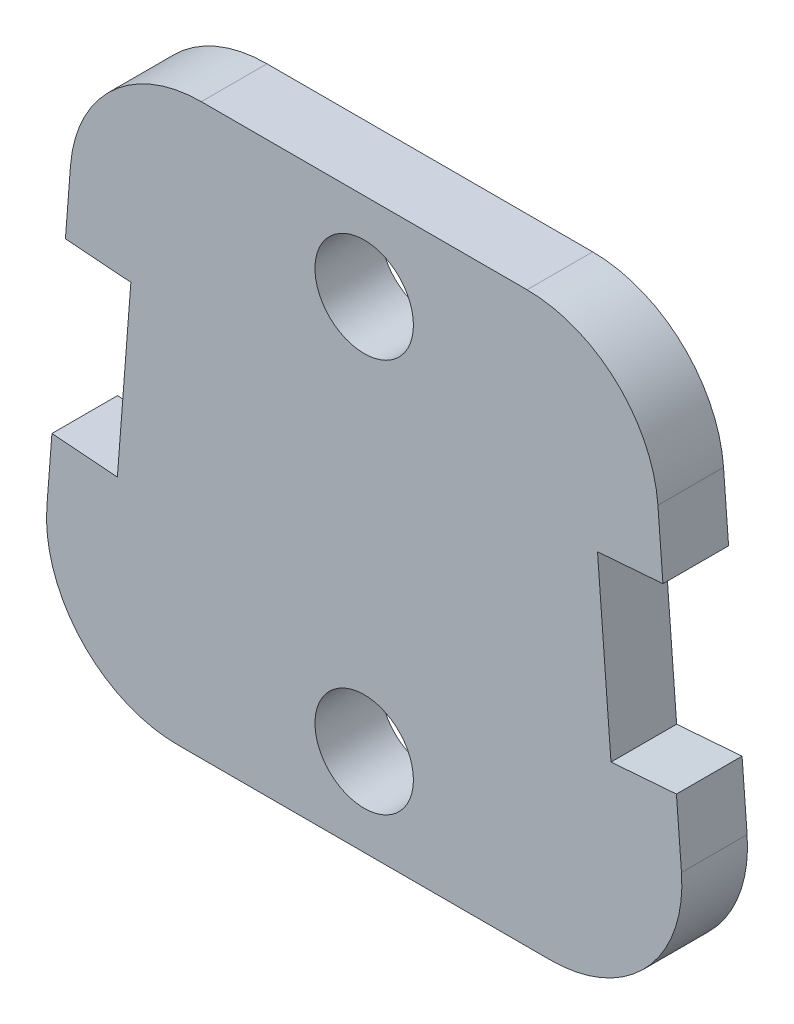
ISO-10303-21;
HEADER;
FILE_DESCRIPTION(('STEP AP214'),'2;1');
FILE_NAME('part.step','',(''),(''),'','','');
FILE_SCHEMA(('AUTOMOTIVE_DESIGN { 1 0 10303 214 1 1 1 1 }'));
ENDSEC;
DATA;
#1=APPLICATION_CONTEXT('core data for automotive mechanical design processes');
#2=APPLICATION_PROTOCOL_DEFINITION('international standard','automotive_design',2000,#1);
#3=PRODUCT_CONTEXT('',#1,'mechanical');
#4=PRODUCT('Part','Part','',(#3));
#5=PRODUCT_RELATED_PRODUCT_CATEGORY('part','',(#4));
#6=PRODUCT_DEFINITION_FORMATION('','',#4);
#7=PRODUCT_DEFINITION_CONTEXT('part definition',#1,'design');
#8=PRODUCT_DEFINITION('design','',#6,#7);
#9=PRODUCT_DEFINITION_SHAPE('','',#8);
#10=(LENGTH_UNIT() NAMED_UNIT(*) SI_UNIT(.MILLI.,.METRE.));
#11=(NAMED_UNIT(*) PLANE_ANGLE_UNIT() SI_UNIT($,.RADIAN.));
#12=(NAMED_UNIT(*) SI_UNIT($,.STERADIAN.) SOLID_ANGLE_UNIT());
#13=UNCERTAINTY_MEASURE_WITH_UNIT(LENGTH_MEASURE(1.E-05),#10,'distance_accuracy_value','');
#14=(GEOMETRIC_REPRESENTATION_CONTEXT(3) GLOBAL_UNCERTAINTY_ASSIGNED_CONTEXT((#13)) GLOBAL_UNIT_ASSIGNED_CONTEXT((#10,
#11,#12)) REPRESENTATION_CONTEXT('',''));
#15=CARTESIAN_POINT('',(0.,0.,0.));
#16=DIRECTION('',(0.,0.,1.));
#17=DIRECTION('',(1.,0.,0.));
#18=AXIS2_PLACEMENT_3D('',#15,#16,#17);
#19=CARTESIAN_POINT('',(0.,0.,3.175));
#20=DIRECTION('',(0.,0.,1.));
#21=DIRECTION('',(1.,0.,0.));
#22=AXIS2_PLACEMENT_3D('',#19,#20,#21);
#23=PLANE('',#22);
#24=CARTESIAN_POINT('',(0.,4.233333291,3.175));
#25=DIRECTION('',(0.,0.,1.));
#26=DIRECTION('',(1.,0.,0.));
#27=AXIS2_PLACEMENT_3D('',#24,#25,#26);
#28=CIRCLE('',#27,2.38125);
#29=CARTESIAN_POINT('',(2.38125,4.233333291,3.175));
#30=VERTEX_POINT('',#29);
#31=EDGE_CURVE('E205',#30,#30,#28,.T.);
#32=ORIENTED_EDGE('',*,*,#31,.F.);
#33=EDGE_LOOP('',(#32));
#34=FACE_BOUND('',#33,.T.);
#35=CARTESIAN_POINT('',(0.,23.283333291,3.175));
#36=DIRECTION('',(0.,0.,1.));
#37=DIRECTION('',(1.,0.,0.));
#38=AXIS2_PLACEMENT_3D('',#35,#36,#37);
#39=CIRCLE('',#38,2.38125);
#40=CARTESIAN_POINT('',(2.38125,23.283333291,3.175));
#41=VERTEX_POINT('',#40);
#42=EDGE_CURVE('E208',#41,#41,#39,.T.);
#43=ORIENTED_EDGE('',*,*,#42,.F.);
#44=EDGE_LOOP('',(#43));
#45=FACE_BOUND('',#44,.T.);
#46=DIRECTION('',(0.0766964988847375,0.997054485501582,0.));
#47=VECTOR('',#46,1.);
#48=CARTESIAN_POINT('',(-12.6159696555913,0.970459204276261,3.175));
#49=LINE('',#48,#47);
#50=CARTESIAN_POINT('',(-11.9399157962721,9.75915937542656,3.175));
#51=VERTEX_POINT('',#50);
#52=CARTESIAN_POINT('',(-11.2871949744466,18.2445300591582,3.175));
#53=VERTEX_POINT('',#52);
#54=EDGE_CURVE('E155',#51,#53,#49,.T.);
#55=ORIENTED_EDGE('',*,*,#54,.F.);
#56=DIRECTION('',(-0.997054485501582,0.0766964988847375,0.));
#57=VECTOR('',#56,1.);
#58=CARTESIAN_POINT('',(-11.9399157962721,9.75915937542656,3.175));
#59=LINE('',#58,#57);
#60=CARTESIAN_POINT('',(-15.1055637877396,10.0026707593856,3.175));
#61=VERTEX_POINT('',#60);
#62=EDGE_CURVE('E164',#51,#61,#59,.T.);
#63=ORIENTED_EDGE('',*,*,#62,.T.);
#64=DIRECTION('',(0.0766964988847375,0.997054485501582,0.));
#65=VECTOR('',#64,1.);
#66=CARTESIAN_POINT('',(-15.7816176470588,1.2139705882353,3.175));
#67=LINE('',#66,#65);
#68=CARTESIAN_POINT('',(-15.3490751716986,6.83702276791813,3.175));
#69=VERTEX_POINT('',#68);
#70=EDGE_CURVE('E217',#69,#61,#67,.T.);
#71=ORIENTED_EDGE('',*,*,#70,.F.);
#72=CARTESIAN_POINT('',(-9.01777918876356,6.35,3.175));
#73=DIRECTION('',(0.,0.,1.));
#74=DIRECTION('',(1.,0.,0.));
#75=AXIS2_PLACEMENT_3D('',#72,#73,#74);
#76=CIRCLE('',#75,6.35);
#77=CARTESIAN_POINT('',(-9.01777918876352,0.,3.175));
#78=VERTEX_POINT('',#77);
#79=EDGE_CURVE('E220',#78,#69,#76,.F.);
#80=ORIENTED_EDGE('',*,*,#79,.F.);
#81=DIRECTION('',(1.,0.,0.));
#82=VECTOR('',#81,1.);
#83=CARTESIAN_POINT('',(0.,0.,3.175));
#84=LINE('',#83,#82);
#85=CARTESIAN_POINT('',(9.01777918876352,0.,3.175));
#86=VERTEX_POINT('',#85);
#87=EDGE_CURVE('E223',#78,#86,#84,.T.);
#88=ORIENTED_EDGE('',*,*,#87,.T.);
#89=CARTESIAN_POINT('',(9.01777918876357,6.35,3.175));
#90=DIRECTION('',(0.,0.,1.));
#91=DIRECTION('',(1.,0.,0.));
#92=AXIS2_PLACEMENT_3D('',#89,#90,#91);
#93=CIRCLE('',#92,6.35);
#94=CARTESIAN_POINT('',(15.3490751716986,6.83702276791813,3.175));
#95=VERTEX_POINT('',#94);
#96=EDGE_CURVE('E226',#86,#95,#93,.T.);
#97=ORIENTED_EDGE('',*,*,#96,.T.);
#98=DIRECTION('',(0.0766964988847368,-0.997054485501582,0.));
#99=VECTOR('',#98,1.);
#100=CARTESIAN_POINT('',(15.7816176470588,1.21397058823529,3.175));
#101=LINE('',#100,#99);
#102=CARTESIAN_POINT('',(15.1055637877396,10.0026707593857,3.175));
#103=VERTEX_POINT('',#102);
#104=EDGE_CURVE('E229',#103,#95,#101,.T.);
#105=ORIENTED_EDGE('',*,*,#104,.F.);
#106=DIRECTION('',(-0.997054485501582,-0.0766964988847379,0.));
#107=VECTOR('',#106,1.);
#108=CARTESIAN_POINT('',(15.1055637877396,10.0026707593857,3.175));
#109=LINE('',#108,#107);
#110=CARTESIAN_POINT('',(11.9399157962721,9.75915937542662,3.175));
#111=VERTEX_POINT('',#110);
#112=EDGE_CURVE('E194',#103,#111,#109,.T.);
#113=ORIENTED_EDGE('',*,*,#112,.T.);
#114=DIRECTION('',(-0.0766964988847378,0.997054485501582,0.));
#115=VECTOR('',#114,1.);
#116=CARTESIAN_POINT('',(11.9399157962721,9.75915937542662,3.175));
#117=LINE('',#116,#115);
#118=CARTESIAN_POINT('',(11.2871949744466,18.2445300591583,3.175));
#119=VERTEX_POINT('',#118);
#120=EDGE_CURVE('E187',#111,#119,#117,.T.);
#121=ORIENTED_EDGE('',*,*,#120,.T.);
#122=DIRECTION('',(-0.997054485501582,-0.0766964988847379,0.));
#123=VECTOR('',#122,1.);
#124=CARTESIAN_POINT('',(14.4528429659141,18.4880414431173,3.175));
#125=LINE('',#124,#123);
#126=CARTESIAN_POINT('',(14.4528429659141,18.4880414431173,3.175));
#127=VERTEX_POINT('',#126);
#128=EDGE_CURVE('E189',#127,#119,#125,.T.);
#129=ORIENTED_EDGE('',*,*,#128,.F.);
#130=CARTESIAN_POINT('',(14.209331581955,21.6536894345847,3.175));
#131=VERTEX_POINT('',#130);
#132=EDGE_CURVE('E230',#131,#127,#101,.T.);
#133=ORIENTED_EDGE('',*,*,#132,.F.);
#134=CARTESIAN_POINT('',(7.87803559901998,21.1666666666667,3.175));
#135=DIRECTION('',(0.,0.,1.));
#136=DIRECTION('',(1.,0.,0.));
#137=AXIS2_PLACEMENT_3D('',#134,#135,#136);
#138=CIRCLE('',#137,6.35);
#139=CARTESIAN_POINT('',(7.87803559901994,27.5166666666667,3.175));
#140=VERTEX_POINT('',#139);
#141=EDGE_CURVE('E233',#140,#131,#138,.F.);
#142=ORIENTED_EDGE('',*,*,#141,.F.);
#143=DIRECTION('',(1.,0.,0.));
#144=VECTOR('',#143,1.);
#145=CARTESIAN_POINT('',(0.,27.5166666666667,3.175));
#146=LINE('',#145,#144);
#147=CARTESIAN_POINT('',(-7.87803559901993,27.5166666666667,3.175));
#148=VERTEX_POINT('',#147);
#149=EDGE_CURVE('E212',#148,#140,#146,.T.);
#150=ORIENTED_EDGE('',*,*,#149,.F.);
#151=CARTESIAN_POINT('',(-7.87803559901997,21.1666666666667,3.175));
#152=DIRECTION('',(0.,0.,1.));
#153=DIRECTION('',(1.,0.,0.));
#154=AXIS2_PLACEMENT_3D('',#151,#152,#153);
#155=CIRCLE('',#154,6.35);
#156=CARTESIAN_POINT('',(-14.209331581955,21.6536894345847,3.175));
#157=VERTEX_POINT('',#156);
#158=EDGE_CURVE('E215',#148,#157,#155,.T.);
#159=ORIENTED_EDGE('',*,*,#158,.T.);
#160=CARTESIAN_POINT('',(-14.4528429659141,18.4880414431173,3.175));
#161=VERTEX_POINT('',#160);
#162=EDGE_CURVE('E176',#161,#157,#67,.T.);
#163=ORIENTED_EDGE('',*,*,#162,.F.);
#164=DIRECTION('',(-0.997054485501582,0.0766964988847375,0.));
#165=VECTOR('',#164,1.);
#166=CARTESIAN_POINT('',(-11.2871949744466,18.2445300591582,3.175));
#167=LINE('',#166,#165);
#168=EDGE_CURVE('E168',#53,#161,#167,.T.);
#169=ORIENTED_EDGE('',*,*,#168,.F.);
#170=EDGE_LOOP('',(#55,#63,#71,#80,#88,#97,#105,#113,#121,#129,#133,#142,#150,#159,#163,#169));
#171=FACE_BOUND('',#170,.T.);
#172=ADVANCED_FACE('F44',(#34,#45,#171),#23,.T.);
#173=CARTESIAN_POINT('',(-15.7816176470588,1.2139705882353,3.175));
#174=DIRECTION('',(-0.997054485501582,0.0766964988847375,0.));
#175=DIRECTION('',(-0.0766964988847375,-0.997054485501582,0.));
#176=AXIS2_PLACEMENT_3D('',#173,#174,#175);
#177=PLANE('',#176);
#178=ORIENTED_EDGE('',*,*,#70,.T.);
#179=DIRECTION('',(0.,0.,-1.));
#180=VECTOR('',#179,1.);
#181=CARTESIAN_POINT('',(-15.1055637877396,10.0026707593856,3.175));
#182=LINE('',#181,#180);
#183=CARTESIAN_POINT('',(-15.1055637877396,10.0026707593856,0.));
#184=VERTEX_POINT('',#183);
#185=EDGE_CURVE('E172',#61,#184,#182,.T.);
#186=ORIENTED_EDGE('',*,*,#185,.T.);
#187=DIRECTION('',(0.0766964988847375,0.997054485501582,0.));
#188=VECTOR('',#187,1.);
#189=CARTESIAN_POINT('',(-15.7816176470588,1.2139705882353,0.));
#190=LINE('',#189,#188);
#191=CARTESIAN_POINT('',(-15.3490751716986,6.83702276791813,0.));
#192=VERTEX_POINT('',#191);
#193=EDGE_CURVE('E249',#192,#184,#190,.T.);
#194=ORIENTED_EDGE('',*,*,#193,.F.);
#195=DIRECTION('',(0.,0.,-1.));
#196=VECTOR('',#195,1.);
#197=CARTESIAN_POINT('',(-15.3490751716986,6.83702276791813,3.175));
#198=LINE('',#197,#196);
#199=EDGE_CURVE('E278',#69,#192,#198,.T.);
#200=ORIENTED_EDGE('',*,*,#199,.F.);
#201=EDGE_LOOP('',(#178,#186,#194,#200));
#202=FACE_BOUND('',#201,.T.);
#203=ADVANCED_FACE('F323',(#202),#177,.T.);
#204=CARTESIAN_POINT('',(15.7816176470588,1.21397058823529,3.175));
#205=DIRECTION('',(0.997054485501582,0.0766964988847368,0.));
#206=DIRECTION('',(-0.0766964988847368,0.997054485501582,0.));
#207=AXIS2_PLACEMENT_3D('',#204,#205,#206);
#208=PLANE('',#207);
#209=DIRECTION('',(0.0766964988847368,-0.997054485501582,0.));
#210=VECTOR('',#209,1.);
#211=CARTESIAN_POINT('',(15.7816176470588,1.21397058823529,0.));
#212=LINE('',#211,#210);
#213=CARTESIAN_POINT('',(15.1055637877396,10.0026707593857,0.));
#214=VERTEX_POINT('',#213);
#215=CARTESIAN_POINT('',(15.3490751716986,6.83702276791813,0.));
#216=VERTEX_POINT('',#215);
#217=EDGE_CURVE('E261',#214,#216,#212,.T.);
#218=ORIENTED_EDGE('',*,*,#217,.F.);
#219=DIRECTION('',(0.,0.,-1.));
#220=VECTOR('',#219,1.);
#221=CARTESIAN_POINT('',(15.1055637877396,10.0026707593857,3.175));
#222=LINE('',#221,#220);
#223=EDGE_CURVE('E186',#103,#214,#222,.T.);
#224=ORIENTED_EDGE('',*,*,#223,.F.);
#225=ORIENTED_EDGE('',*,*,#104,.T.);
#226=DIRECTION('',(0.,0.,-1.));
#227=VECTOR('',#226,1.);
#228=CARTESIAN_POINT('',(15.3490751716986,6.83702276791813,3.175));
#229=LINE('',#228,#227);
#230=EDGE_CURVE('E270',#95,#216,#229,.T.);
#231=ORIENTED_EDGE('',*,*,#230,.T.);
#232=EDGE_LOOP('',(#218,#224,#225,#231));
#233=FACE_BOUND('',#232,.T.);
#234=ADVANCED_FACE('F306',(#233),#208,.T.);
#235=CARTESIAN_POINT('',(0.,27.5166666666667,3.175));
#236=DIRECTION('',(0.,1.,0.));
#237=DIRECTION('',(-1.,0.,0.));
#238=AXIS2_PLACEMENT_3D('',#235,#236,#237);
#239=PLANE('',#238);
#240=DIRECTION('',(1.,0.,0.));
#241=VECTOR('',#240,1.);
#242=CARTESIAN_POINT('',(0.,27.5166666666667,0.));
#243=LINE('',#242,#241);
#244=CARTESIAN_POINT('',(-7.87803559901993,27.5166666666667,0.));
#245=VERTEX_POINT('',#244);
#246=CARTESIAN_POINT('',(7.87803559901994,27.5166666666667,0.));
#247=VERTEX_POINT('',#246);
#248=EDGE_CURVE('E242',#245,#247,#243,.T.);
#249=ORIENTED_EDGE('',*,*,#248,.F.);
#250=DIRECTION('',(0.,0.,-1.));
#251=VECTOR('',#250,1.);
#252=CARTESIAN_POINT('',(-7.87803559901993,27.5166666666667,3.175));
#253=LINE('',#252,#251);
#254=EDGE_CURVE('E283',#148,#245,#253,.T.);
#255=ORIENTED_EDGE('',*,*,#254,.F.);
#256=ORIENTED_EDGE('',*,*,#149,.T.);
#257=DIRECTION('',(0.,0.,-1.));
#258=VECTOR('',#257,1.);
#259=CARTESIAN_POINT('',(7.87803559901994,27.5166666666667,3.175));
#260=LINE('',#259,#258);
#261=EDGE_CURVE('E236',#140,#247,#260,.T.);
#262=ORIENTED_EDGE('',*,*,#261,.T.);
#263=EDGE_LOOP('',(#249,#255,#256,#262));
#264=FACE_BOUND('',#263,.T.);
#265=ADVANCED_FACE('F372',(#264),#239,.T.);
#266=CARTESIAN_POINT('',(-7.87803559901997,21.1666666666667,3.175));
#267=DIRECTION('',(0.,0.,-1.));
#268=DIRECTION('',(-1.,0.,0.));
#269=AXIS2_PLACEMENT_3D('',#266,#267,#268);
#270=CYLINDRICAL_SURFACE('',#269,6.35);
#271=CARTESIAN_POINT('',(-7.87803559901997,21.1666666666667,0.));
#272=DIRECTION('',(0.,0.,1.));
#273=DIRECTION('',(1.,0.,0.));
#274=AXIS2_PLACEMENT_3D('',#271,#272,#273);
#275=CIRCLE('',#274,6.35);
#276=CARTESIAN_POINT('',(-14.209331581955,21.6536894345847,0.));
#277=VERTEX_POINT('',#276);
#278=EDGE_CURVE('E245',#245,#277,#275,.T.);
#279=ORIENTED_EDGE('',*,*,#278,.T.);
#280=DIRECTION('',(0.,0.,-1.));
#281=VECTOR('',#280,1.);
#282=CARTESIAN_POINT('',(-14.209331581955,21.6536894345847,3.175));
#283=LINE('',#282,#281);
#284=EDGE_CURVE('E280',#157,#277,#283,.T.);
#285=ORIENTED_EDGE('',*,*,#284,.F.);
#286=ORIENTED_EDGE('',*,*,#158,.F.);
#287=ORIENTED_EDGE('',*,*,#254,.T.);
#288=EDGE_LOOP('',(#279,#285,#286,#287));
#289=FACE_BOUND('',#288,.T.);
#290=ADVANCED_FACE('F368',(#289),#270,.T.);
#291=DIRECTION('',(0.,0.,-1.));
#292=VECTOR('',#291,1.);
#293=CARTESIAN_POINT('',(-14.4528429659141,18.4880414431173,3.175));
#294=LINE('',#293,#292);
#295=CARTESIAN_POINT('',(-14.4528429659141,18.4880414431173,0.));
#296=VERTEX_POINT('',#295);
#297=EDGE_CURVE('E326',#161,#296,#294,.T.);
#298=ORIENTED_EDGE('',*,*,#297,.F.);
#299=ORIENTED_EDGE('',*,*,#162,.T.);
#300=ORIENTED_EDGE('',*,*,#284,.T.);
#301=EDGE_CURVE('E248',#296,#277,#190,.T.);
#302=ORIENTED_EDGE('',*,*,#301,.F.);
#303=EDGE_LOOP('',(#298,#299,#300,#302));
#304=FACE_BOUND('',#303,.T.);
#305=ADVANCED_FACE('F346',(#304),#177,.T.);
#306=CARTESIAN_POINT('',(-9.01777918876356,6.35,3.175));
#307=DIRECTION('',(0.,0.,-1.));
#308=DIRECTION('',(-1.,0.,0.));
#309=AXIS2_PLACEMENT_3D('',#306,#307,#308);
#310=CYLINDRICAL_SURFACE('',#309,6.35);
#311=CARTESIAN_POINT('',(-9.01777918876356,6.35,0.));
#312=DIRECTION('',(0.,0.,1.));
#313=DIRECTION('',(1.,0.,0.));
#314=AXIS2_PLACEMENT_3D('',#311,#312,#313);
#315=CIRCLE('',#314,6.35);
#316=CARTESIAN_POINT('',(-9.01777918876352,0.,0.));
#317=VERTEX_POINT('',#316);
#318=EDGE_CURVE('E252',#317,#192,#315,.F.);
#319=ORIENTED_EDGE('',*,*,#318,.F.);
#320=DIRECTION('',(0.,0.,-1.));
#321=VECTOR('',#320,1.);
#322=CARTESIAN_POINT('',(-9.01777918876352,0.,3.175));
#323=LINE('',#322,#321);
#324=EDGE_CURVE('E276',#78,#317,#323,.T.);
#325=ORIENTED_EDGE('',*,*,#324,.F.);
#326=ORIENTED_EDGE('',*,*,#79,.T.);
#327=ORIENTED_EDGE('',*,*,#199,.T.);
#328=EDGE_LOOP('',(#319,#325,#326,#327));
#329=FACE_BOUND('',#328,.T.);
#330=ADVANCED_FACE('F318',(#329),#310,.T.);
#331=CARTESIAN_POINT('',(0.,0.,3.175));
#332=DIRECTION('',(0.,1.,0.));
#333=DIRECTION('',(0.,0.,1.));
#334=AXIS2_PLACEMENT_3D('',#331,#332,#333);
#335=PLANE('',#334);
#336=DIRECTION('',(1.,0.,0.));
#337=VECTOR('',#336,1.);
#338=CARTESIAN_POINT('',(0.,0.,0.));
#339=LINE('',#338,#337);
#340=CARTESIAN_POINT('',(9.01777918876352,0.,0.));
#341=VERTEX_POINT('',#340);
#342=EDGE_CURVE('E255',#317,#341,#339,.T.);
#343=ORIENTED_EDGE('',*,*,#342,.T.);
#344=DIRECTION('',(0.,0.,-1.));
#345=VECTOR('',#344,1.);
#346=CARTESIAN_POINT('',(9.01777918876352,0.,3.175));
#347=LINE('',#346,#345);
#348=EDGE_CURVE('E273',#86,#341,#347,.T.);
#349=ORIENTED_EDGE('',*,*,#348,.F.);
#350=ORIENTED_EDGE('',*,*,#87,.F.);
#351=ORIENTED_EDGE('',*,*,#324,.T.);
#352=EDGE_LOOP('',(#343,#349,#350,#351));
#353=FACE_BOUND('',#352,.T.);
#354=ADVANCED_FACE('F315',(#353),#335,.F.);
#355=CARTESIAN_POINT('',(9.01777918876357,6.35,3.175));
#356=DIRECTION('',(0.,0.,-1.));
#357=DIRECTION('',(-1.,0.,0.));
#358=AXIS2_PLACEMENT_3D('',#355,#356,#357);
#359=CYLINDRICAL_SURFACE('',#358,6.35);
#360=CARTESIAN_POINT('',(9.01777918876357,6.35,0.));
#361=DIRECTION('',(0.,0.,1.));
#362=DIRECTION('',(1.,0.,0.));
#363=AXIS2_PLACEMENT_3D('',#360,#361,#362);
#364=CIRCLE('',#363,6.35);
#365=EDGE_CURVE('E258',#341,#216,#364,.T.);
#366=ORIENTED_EDGE('',*,*,#365,.T.);
#367=ORIENTED_EDGE('',*,*,#230,.F.);
#368=ORIENTED_EDGE('',*,*,#96,.F.);
#369=ORIENTED_EDGE('',*,*,#348,.T.);
#370=EDGE_LOOP('',(#366,#367,#368,#369));
#371=FACE_BOUND('',#370,.T.);
#372=ADVANCED_FACE('F312',(#371),#359,.T.);
#373=DIRECTION('',(0.,0.,-1.));
#374=VECTOR('',#373,1.);
#375=CARTESIAN_POINT('',(14.4528429659141,18.4880414431173,3.175));
#376=LINE('',#375,#374);
#377=CARTESIAN_POINT('',(14.4528429659141,18.4880414431173,0.));
#378=VERTEX_POINT('',#377);
#379=EDGE_CURVE('E183',#127,#378,#376,.T.);
#380=ORIENTED_EDGE('',*,*,#379,.T.);
#381=CARTESIAN_POINT('',(14.209331581955,21.6536894345847,0.));
#382=VERTEX_POINT('',#381);
#383=EDGE_CURVE('E262',#382,#378,#212,.T.);
#384=ORIENTED_EDGE('',*,*,#383,.F.);
#385=DIRECTION('',(0.,0.,-1.));
#386=VECTOR('',#385,1.);
#387=CARTESIAN_POINT('',(14.209331581955,21.6536894345847,3.175));
#388=LINE('',#387,#386);
#389=EDGE_CURVE('E268',#131,#382,#388,.T.);
#390=ORIENTED_EDGE('',*,*,#389,.F.);
#391=ORIENTED_EDGE('',*,*,#132,.T.);
#392=EDGE_LOOP('',(#380,#384,#390,#391));
#393=FACE_BOUND('',#392,.T.);
#394=ADVANCED_FACE('F297',(#393),#208,.T.);
#395=CARTESIAN_POINT('',(0.,23.283333291,3.175));
#396=DIRECTION('',(0.,0.,-1.));
#397=DIRECTION('',(-1.,0.,0.));
#398=AXIS2_PLACEMENT_3D('',#395,#396,#397);
#399=CYLINDRICAL_SURFACE('',#398,2.38125);
#400=ORIENTED_EDGE('',*,*,#42,.T.);
#401=EDGE_LOOP('',(#400));
#402=FACE_BOUND('',#401,.T.);
#403=CARTESIAN_POINT('',(0.,23.283333291,0.));
#404=DIRECTION('',(0.,0.,1.));
#405=DIRECTION('',(1.,0.,0.));
#406=AXIS2_PLACEMENT_3D('',#403,#404,#405);
#407=CIRCLE('',#406,2.38125);
#408=CARTESIAN_POINT('',(2.38125,23.283333291,0.));
#409=VERTEX_POINT('',#408);
#410=EDGE_CURVE('E239',#409,#409,#407,.T.);
#411=ORIENTED_EDGE('',*,*,#410,.F.);
#412=EDGE_LOOP('',(#411));
#413=FACE_BOUND('',#412,.T.);
#414=ADVANCED_FACE('F360',(#402,#413),#399,.F.);
#415=CARTESIAN_POINT('',(0.,4.233333291,3.175));
#416=DIRECTION('',(0.,0.,-1.));
#417=DIRECTION('',(-1.,0.,0.));
#418=AXIS2_PLACEMENT_3D('',#415,#416,#417);
#419=CYLINDRICAL_SURFACE('',#418,2.38125);
#420=ORIENTED_EDGE('',*,*,#31,.T.);
#421=EDGE_LOOP('',(#420));
#422=FACE_BOUND('',#421,.T.);
#423=CARTESIAN_POINT('',(0.,4.233333291,0.));
#424=DIRECTION('',(0.,0.,1.));
#425=DIRECTION('',(1.,0.,0.));
#426=AXIS2_PLACEMENT_3D('',#423,#424,#425);
#427=CIRCLE('',#426,2.38125);
#428=CARTESIAN_POINT('',(2.38125,4.233333291,0.));
#429=VERTEX_POINT('',#428);
#430=EDGE_CURVE('E197',#429,#429,#427,.T.);
#431=ORIENTED_EDGE('',*,*,#430,.F.);
#432=EDGE_LOOP('',(#431));
#433=FACE_BOUND('',#432,.T.);
#434=ADVANCED_FACE('F46',(#422,#433),#419,.F.);
#435=CARTESIAN_POINT('',(7.87803559901998,21.1666666666667,3.175));
#436=DIRECTION('',(0.,0.,-1.));
#437=DIRECTION('',(-1.,0.,0.));
#438=AXIS2_PLACEMENT_3D('',#435,#436,#437);
#439=CYLINDRICAL_SURFACE('',#438,6.35);
#440=CARTESIAN_POINT('',(7.87803559901998,21.1666666666667,0.));
#441=DIRECTION('',(0.,0.,1.));
#442=DIRECTION('',(1.,0.,0.));
#443=AXIS2_PLACEMENT_3D('',#440,#441,#442);
#444=CIRCLE('',#443,6.35);
#445=EDGE_CURVE('E209',#247,#382,#444,.F.);
#446=ORIENTED_EDGE('',*,*,#445,.F.);
#447=ORIENTED_EDGE('',*,*,#261,.F.);
#448=ORIENTED_EDGE('',*,*,#141,.T.);
#449=ORIENTED_EDGE('',*,*,#389,.T.);
#450=EDGE_LOOP('',(#446,#447,#448,#449));
#451=FACE_BOUND('',#450,.T.);
#452=ADVANCED_FACE('F354',(#451),#439,.T.);
#453=CARTESIAN_POINT('',(0.,0.,0.));
#454=DIRECTION('',(0.,0.,1.));
#455=DIRECTION('',(1.,0.,0.));
#456=AXIS2_PLACEMENT_3D('',#453,#454,#455);
#457=PLANE('',#456);
#458=ORIENTED_EDGE('',*,*,#318,.T.);
#459=ORIENTED_EDGE('',*,*,#193,.T.);
#460=DIRECTION('',(-0.997054485501582,0.0766964988847375,0.));
#461=VECTOR('',#460,1.);
#462=CARTESIAN_POINT('',(-11.9399157962721,9.75915937542656,0.));
#463=LINE('',#462,#461);
#464=CARTESIAN_POINT('',(-11.9399157962721,9.75915937542656,0.));
#465=VERTEX_POINT('',#464);
#466=EDGE_CURVE('E178',#465,#184,#463,.T.);
#467=ORIENTED_EDGE('',*,*,#466,.F.);
#468=DIRECTION('',(0.0766964988847375,0.997054485501582,0.));
#469=VECTOR('',#468,1.);
#470=CARTESIAN_POINT('',(-12.6159696555913,0.970459204276261,0.));
#471=LINE('',#470,#469);
#472=CARTESIAN_POINT('',(-11.2871949744466,18.2445300591582,0.));
#473=VERTEX_POINT('',#472);
#474=EDGE_CURVE('E13',#465,#473,#471,.T.);
#475=ORIENTED_EDGE('',*,*,#474,.T.);
#476=DIRECTION('',(-0.997054485501582,0.0766964988847375,0.));
#477=VECTOR('',#476,1.);
#478=CARTESIAN_POINT('',(-11.2871949744466,18.2445300591582,0.));
#479=LINE('',#478,#477);
#480=EDGE_CURVE('E171',#473,#296,#479,.T.);
#481=ORIENTED_EDGE('',*,*,#480,.T.);
#482=ORIENTED_EDGE('',*,*,#301,.T.);
#483=ORIENTED_EDGE('',*,*,#278,.F.);
#484=ORIENTED_EDGE('',*,*,#248,.T.);
#485=ORIENTED_EDGE('',*,*,#445,.T.);
#486=ORIENTED_EDGE('',*,*,#383,.T.);
#487=DIRECTION('',(-0.997054485501582,-0.0766964988847379,0.));
#488=VECTOR('',#487,1.);
#489=CARTESIAN_POINT('',(14.4528429659141,18.4880414431173,0.));
#490=LINE('',#489,#488);
#491=CARTESIAN_POINT('',(11.2871949744466,18.2445300591583,0.));
#492=VERTEX_POINT('',#491);
#493=EDGE_CURVE('E200',#378,#492,#490,.T.);
#494=ORIENTED_EDGE('',*,*,#493,.T.);
#495=DIRECTION('',(-0.0766964988847379,0.997054485501581,0.));
#496=VECTOR('',#495,1.);
#497=CARTESIAN_POINT('',(12.6159696555913,0.970459204276267,0.));
#498=LINE('',#497,#496);
#499=CARTESIAN_POINT('',(11.9399157962721,9.75915937542662,0.));
#500=VERTEX_POINT('',#499);
#501=EDGE_CURVE('E52',#500,#492,#498,.T.);
#502=ORIENTED_EDGE('',*,*,#501,.F.);
#503=DIRECTION('',(-0.997054485501582,-0.0766964988847379,0.));
#504=VECTOR('',#503,1.);
#505=CARTESIAN_POINT('',(15.1055637877396,10.0026707593857,0.));
#506=LINE('',#505,#504);
#507=EDGE_CURVE('E198',#214,#500,#506,.T.);
#508=ORIENTED_EDGE('',*,*,#507,.F.);
#509=ORIENTED_EDGE('',*,*,#217,.T.);
#510=ORIENTED_EDGE('',*,*,#365,.F.);
#511=ORIENTED_EDGE('',*,*,#342,.F.);
#512=EDGE_LOOP('',(#458,#459,#467,#475,#481,#482,#483,#484,#485,#486,#494,#502,#508,#509,#510,#511));
#513=FACE_BOUND('',#512,.T.);
#514=ORIENTED_EDGE('',*,*,#430,.T.);
#515=EDGE_LOOP('',(#514));
#516=FACE_BOUND('',#515,.T.);
#517=ORIENTED_EDGE('',*,*,#410,.T.);
#518=EDGE_LOOP('',(#517));
#519=FACE_BOUND('',#518,.T.);
#520=ADVANCED_FACE('F292',(#513,#516,#519),#457,.F.);
#521=CARTESIAN_POINT('',(11.4961993820364,15.5274727604898,12.4447406532114));
#522=DIRECTION('',(0.997054485501582,0.0766964988847379,0.));
#523=DIRECTION('',(0.,0.,-1.));
#524=AXIS2_PLACEMENT_3D('',#521,#522,#523);
#525=PLANE('',#524);
#526=ORIENTED_EDGE('',*,*,#120,.F.);
#527=DIRECTION('',(0.,0.,-1.));
#528=VECTOR('',#527,1.);
#529=CARTESIAN_POINT('',(11.9399157962721,9.75915937542662,3.175));
#530=LINE('',#529,#528);
#531=EDGE_CURVE('E67',#111,#500,#530,.T.);
#532=ORIENTED_EDGE('',*,*,#531,.T.);
#533=ORIENTED_EDGE('',*,*,#501,.T.);
#534=DIRECTION('',(0.,0.,-1.));
#535=VECTOR('',#534,1.);
#536=CARTESIAN_POINT('',(11.2871949744466,18.2445300591583,3.175));
#537=LINE('',#536,#535);
#538=EDGE_CURVE('E163',#119,#492,#537,.T.);
#539=ORIENTED_EDGE('',*,*,#538,.F.);
#540=EDGE_LOOP('',(#526,#532,#533,#539));
#541=FACE_BOUND('',#540,.T.);
#542=ADVANCED_FACE('F286',(#541),#525,.T.);
#543=CARTESIAN_POINT('',(15.1055637877396,10.0026707593857,3.175));
#544=DIRECTION('',(-0.0766964988847378,0.997054485501582,0.));
#545=DIRECTION('',(-0.997054485501582,-0.0766964988847379,0.));
#546=AXIS2_PLACEMENT_3D('',#543,#544,#545);
#547=PLANE('',#546);
#548=ORIENTED_EDGE('',*,*,#531,.F.);
#549=ORIENTED_EDGE('',*,*,#112,.F.);
#550=ORIENTED_EDGE('',*,*,#223,.T.);
#551=ORIENTED_EDGE('',*,*,#507,.T.);
#552=EDGE_LOOP('',(#548,#549,#550,#551));
#553=FACE_BOUND('',#552,.T.);
#554=ADVANCED_FACE('F303',(#553),#547,.T.);
#555=CARTESIAN_POINT('',(14.4528429659141,18.4880414431173,3.175));
#556=DIRECTION('',(-0.0766964988847378,0.997054485501582,0.));
#557=DIRECTION('',(-0.997054485501582,-0.0766964988847379,0.));
#558=AXIS2_PLACEMENT_3D('',#555,#556,#557);
#559=PLANE('',#558);
#560=ORIENTED_EDGE('',*,*,#538,.T.);
#561=ORIENTED_EDGE('',*,*,#493,.F.);
#562=ORIENTED_EDGE('',*,*,#379,.F.);
#563=ORIENTED_EDGE('',*,*,#128,.T.);
#564=EDGE_LOOP('',(#560,#561,#562,#563));
#565=FACE_BOUND('',#564,.T.);
#566=ADVANCED_FACE('F290',(#565),#559,.F.);
#567=CARTESIAN_POINT('',(-11.4961993820364,15.5274727604897,12.4447406532114));
#568=DIRECTION('',(0.997054485501582,-0.0766964988847375,0.));
#569=DIRECTION('',(0.,0.,-1.));
#570=AXIS2_PLACEMENT_3D('',#567,#568,#569);
#571=PLANE('',#570);
#572=ORIENTED_EDGE('',*,*,#54,.T.);
#573=DIRECTION('',(0.,0.,-1.));
#574=VECTOR('',#573,1.);
#575=CARTESIAN_POINT('',(-11.2871949744466,18.2445300591582,3.175));
#576=LINE('',#575,#574);
#577=EDGE_CURVE('E59',#53,#473,#576,.T.);
#578=ORIENTED_EDGE('',*,*,#577,.T.);
#579=ORIENTED_EDGE('',*,*,#474,.F.);
#580=DIRECTION('',(0.,0.,-1.));
#581=VECTOR('',#580,1.);
#582=CARTESIAN_POINT('',(-11.9399157962721,9.75915937542656,3.175));
#583=LINE('',#582,#581);
#584=EDGE_CURVE('E158',#51,#465,#583,.T.);
#585=ORIENTED_EDGE('',*,*,#584,.F.);
#586=EDGE_LOOP('',(#572,#578,#579,#585));
#587=FACE_BOUND('',#586,.T.);
#588=ADVANCED_FACE('F156',(#587),#571,.F.);
#589=CARTESIAN_POINT('',(-11.9399157962721,9.75915937542656,3.175));
#590=DIRECTION('',(0.0766964988847375,0.997054485501582,0.));
#591=DIRECTION('',(-0.997054485501582,0.0766964988847375,0.));
#592=AXIS2_PLACEMENT_3D('',#589,#590,#591);
#593=PLANE('',#592);
#594=ORIENTED_EDGE('',*,*,#185,.F.);
#595=ORIENTED_EDGE('',*,*,#62,.F.);
#596=ORIENTED_EDGE('',*,*,#584,.T.);
#597=ORIENTED_EDGE('',*,*,#466,.T.);
#598=EDGE_LOOP('',(#594,#595,#596,#597));
#599=FACE_BOUND('',#598,.T.);
#600=ADVANCED_FACE('F330',(#599),#593,.T.);
#601=CARTESIAN_POINT('',(-11.2871949744466,18.2445300591582,3.175));
#602=DIRECTION('',(0.0766964988847375,0.997054485501582,0.));
#603=DIRECTION('',(-0.997054485501582,0.0766964988847375,0.));
#604=AXIS2_PLACEMENT_3D('',#601,#602,#603);
#605=PLANE('',#604);
#606=ORIENTED_EDGE('',*,*,#297,.T.);
#607=ORIENTED_EDGE('',*,*,#480,.F.);
#608=ORIENTED_EDGE('',*,*,#577,.F.);
#609=ORIENTED_EDGE('',*,*,#168,.T.);
#610=EDGE_LOOP('',(#606,#607,#608,#609));
#611=FACE_BOUND('',#610,.T.);
#612=ADVANCED_FACE('F167',(#611),#605,.F.);
#613=CLOSED_SHELL('',(#172,#203,#234,#265,#290,#305,#330,#354,#372,#394,#414,#434,#452,#520,
#542,#554,#566,#588,#600,#612));
#614=MANIFOLD_SOLID_BREP('B2',#613);
#615=ADVANCED_BREP_SHAPE_REPRESENTATION('',(#18,#614),#14);
#616=SHAPE_DEFINITION_REPRESENTATION(#9,#615);
ENDSEC;
END-ISO-10303-21;
